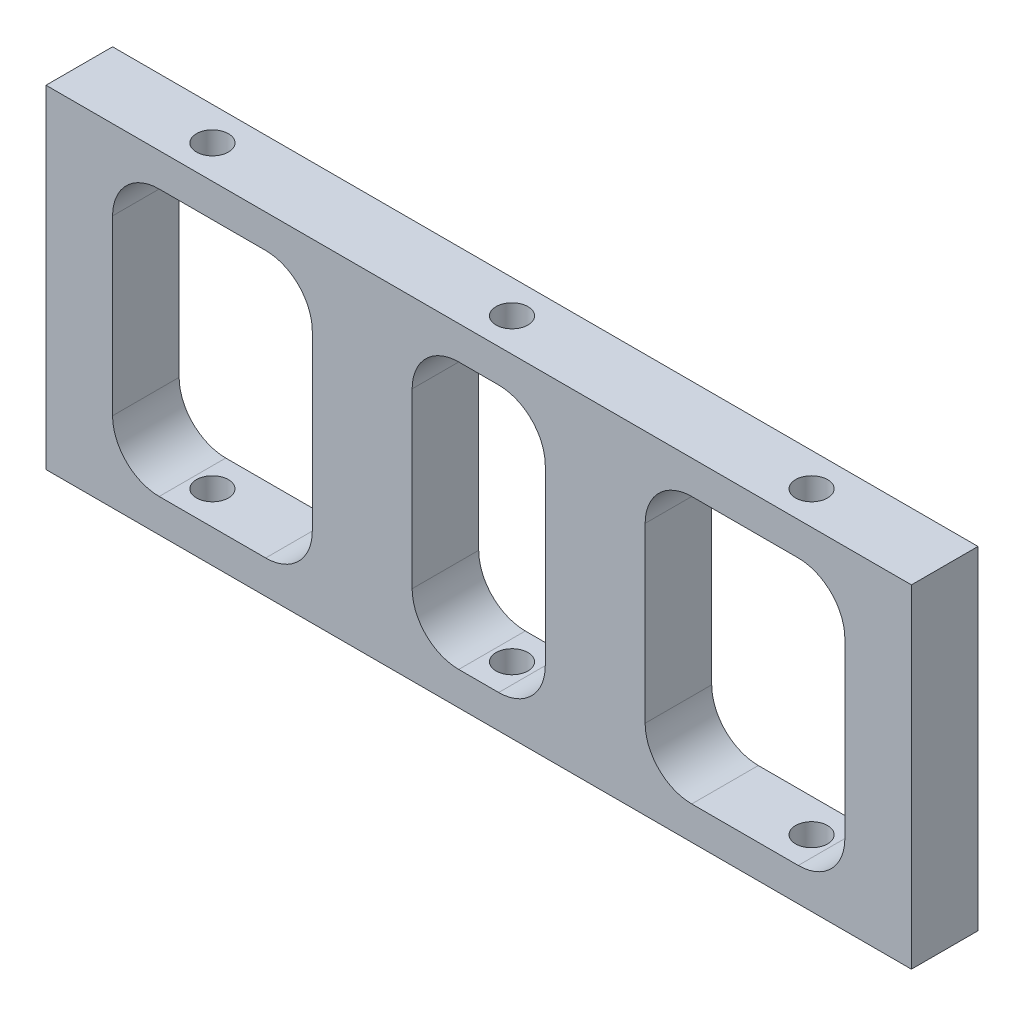
ISO-10303-21;
HEADER;
FILE_DESCRIPTION(('STEP AP214'),'2;1');
FILE_NAME('part.step','',(''),(''),'','','');
FILE_SCHEMA(('AUTOMOTIVE_DESIGN { 1 0 10303 214 1 1 1 1 }'));
ENDSEC;
DATA;
#1=APPLICATION_CONTEXT('core data for automotive mechanical design processes');
#2=APPLICATION_PROTOCOL_DEFINITION('international standard','automotive_design',2000,#1);
#3=PRODUCT_CONTEXT('',#1,'mechanical');
#4=PRODUCT('Part','Part','',(#3));
#5=PRODUCT_RELATED_PRODUCT_CATEGORY('part','',(#4));
#6=PRODUCT_DEFINITION_FORMATION('','',#4);
#7=PRODUCT_DEFINITION_CONTEXT('part definition',#1,'design');
#8=PRODUCT_DEFINITION('design','',#6,#7);
#9=PRODUCT_DEFINITION_SHAPE('','',#8);
#10=(LENGTH_UNIT() NAMED_UNIT(*) SI_UNIT(.MILLI.,.METRE.));
#11=(NAMED_UNIT(*) PLANE_ANGLE_UNIT() SI_UNIT($,.RADIAN.));
#12=(NAMED_UNIT(*) SI_UNIT($,.STERADIAN.) SOLID_ANGLE_UNIT());
#13=UNCERTAINTY_MEASURE_WITH_UNIT(LENGTH_MEASURE(1.E-05),#10,'distance_accuracy_value','');
#14=(GEOMETRIC_REPRESENTATION_CONTEXT(3) GLOBAL_UNCERTAINTY_ASSIGNED_CONTEXT((#13)) GLOBAL_UNIT_ASSIGNED_CONTEXT((#10,
#11,#12)) REPRESENTATION_CONTEXT('',''));
#15=CARTESIAN_POINT('',(0.,0.,0.));
#16=DIRECTION('',(0.,0.,1.));
#17=DIRECTION('',(1.,0.,0.));
#18=AXIS2_PLACEMENT_3D('',#15,#16,#17);
#19=CARTESIAN_POINT('',(0.,50.,10.));
#20=DIRECTION('',(0.,1.,0.));
#21=DIRECTION('',(-1.,0.,0.));
#22=AXIS2_PLACEMENT_3D('',#19,#20,#21);
#23=PLANE('',#22);
#24=CARTESIAN_POINT('',(20.,50.,5.));
#25=DIRECTION('',(0.,1.,0.));
#26=DIRECTION('',(0.,0.,1.));
#27=AXIS2_PLACEMENT_3D('',#24,#25,#26);
#28=CIRCLE('',#27,2.4);
#29=CARTESIAN_POINT('',(20.,50.,7.4));
#30=VERTEX_POINT('',#29);
#31=EDGE_CURVE('E685',#30,#30,#28,.T.);
#32=ORIENTED_EDGE('',*,*,#31,.F.);
#33=EDGE_LOOP('',(#32));
#34=FACE_BOUND('',#33,.T.);
#35=CARTESIAN_POINT('',(65.,50.,5.));
#36=DIRECTION('',(0.,1.,0.));
#37=DIRECTION('',(0.,0.,1.));
#38=AXIS2_PLACEMENT_3D('',#35,#36,#37);
#39=CIRCLE('',#38,2.4);
#40=CARTESIAN_POINT('',(65.,50.,7.4));
#41=VERTEX_POINT('',#40);
#42=EDGE_CURVE('E688',#41,#41,#39,.T.);
#43=ORIENTED_EDGE('',*,*,#42,.F.);
#44=EDGE_LOOP('',(#43));
#45=FACE_BOUND('',#44,.T.);
#46=CARTESIAN_POINT('',(110.,50.,5.));
#47=DIRECTION('',(0.,1.,0.));
#48=DIRECTION('',(0.,0.,1.));
#49=AXIS2_PLACEMENT_3D('',#46,#47,#48);
#50=CIRCLE('',#49,2.4);
#51=CARTESIAN_POINT('',(110.,50.,7.4));
#52=VERTEX_POINT('',#51);
#53=EDGE_CURVE('E701',#52,#52,#50,.T.);
#54=ORIENTED_EDGE('',*,*,#53,.F.);
#55=EDGE_LOOP('',(#54));
#56=FACE_BOUND('',#55,.T.);
#57=DIRECTION('',(1.,0.,0.));
#58=VECTOR('',#57,1.);
#59=CARTESIAN_POINT('',(0.,50.,0.));
#60=LINE('',#59,#58);
#61=CARTESIAN_POINT('',(0.,50.,0.));
#62=VERTEX_POINT('',#61);
#63=CARTESIAN_POINT('',(130.,50.0000000000001,0.));
#64=VERTEX_POINT('',#63);
#65=EDGE_CURVE('E236',#62,#64,#60,.T.);
#66=ORIENTED_EDGE('',*,*,#65,.F.);
#67=DIRECTION('',(0.,0.,-1.));
#68=VECTOR('',#67,1.);
#69=CARTESIAN_POINT('',(0.,50.,10.));
#70=LINE('',#69,#68);
#71=CARTESIAN_POINT('',(0.,50.,10.));
#72=VERTEX_POINT('',#71);
#73=EDGE_CURVE('E232',#72,#62,#70,.T.);
#74=ORIENTED_EDGE('',*,*,#73,.F.);
#75=DIRECTION('',(1.,0.,0.));
#76=VECTOR('',#75,1.);
#77=CARTESIAN_POINT('',(0.,50.,10.));
#78=LINE('',#77,#76);
#79=CARTESIAN_POINT('',(130.,50.0000000000001,10.));
#80=VERTEX_POINT('',#79);
#81=EDGE_CURVE('E234',#72,#80,#78,.T.);
#82=ORIENTED_EDGE('',*,*,#81,.T.);
#83=DIRECTION('',(0.,0.,-1.));
#84=VECTOR('',#83,1.);
#85=CARTESIAN_POINT('',(130.,50.0000000000001,10.));
#86=LINE('',#85,#84);
#87=EDGE_CURVE('E266',#80,#64,#86,.T.);
#88=ORIENTED_EDGE('',*,*,#87,.T.);
#89=EDGE_LOOP('',(#66,#74,#82,#88));
#90=FACE_BOUND('',#89,.T.);
#91=ADVANCED_FACE('F45',(#34,#45,#56,#90),#23,.T.);
#92=CARTESIAN_POINT('',(0.,0.,10.));
#93=DIRECTION('',(-1.,0.,0.));
#94=DIRECTION('',(0.,-1.,0.));
#95=AXIS2_PLACEMENT_3D('',#92,#93,#94);
#96=PLANE('',#95);
#97=DIRECTION('',(0.,1.,0.));
#98=VECTOR('',#97,1.);
#99=CARTESIAN_POINT('',(0.,0.,0.));
#100=LINE('',#99,#98);
#101=CARTESIAN_POINT('',(0.,0.,0.));
#102=VERTEX_POINT('',#101);
#103=EDGE_CURVE('E304',#102,#62,#100,.T.);
#104=ORIENTED_EDGE('',*,*,#103,.F.);
#105=DIRECTION('',(0.,0.,-1.));
#106=VECTOR('',#105,1.);
#107=CARTESIAN_POINT('',(0.,0.,10.));
#108=LINE('',#107,#106);
#109=CARTESIAN_POINT('',(0.,0.,10.));
#110=VERTEX_POINT('',#109);
#111=EDGE_CURVE('E243',#110,#102,#108,.T.);
#112=ORIENTED_EDGE('',*,*,#111,.F.);
#113=DIRECTION('',(0.,1.,0.));
#114=VECTOR('',#113,1.);
#115=CARTESIAN_POINT('',(0.,0.,10.));
#116=LINE('',#115,#114);
#117=EDGE_CURVE('E249',#110,#72,#116,.T.);
#118=ORIENTED_EDGE('',*,*,#117,.T.);
#119=ORIENTED_EDGE('',*,*,#73,.T.);
#120=EDGE_LOOP('',(#104,#112,#118,#119));
#121=FACE_BOUND('',#120,.T.);
#122=ADVANCED_FACE('F255',(#121),#96,.T.);
#123=CARTESIAN_POINT('',(0.,0.,10.));
#124=DIRECTION('',(0.,1.,0.));
#125=DIRECTION('',(-1.,0.,0.));
#126=AXIS2_PLACEMENT_3D('',#123,#124,#125);
#127=PLANE('',#126);
#128=CARTESIAN_POINT('',(20.,0.,5.));
#129=DIRECTION('',(0.,1.,0.));
#130=DIRECTION('',(0.,0.,1.));
#131=AXIS2_PLACEMENT_3D('',#128,#129,#130);
#132=CIRCLE('',#131,2.4);
#133=CARTESIAN_POINT('',(20.,0.,7.4));
#134=VERTEX_POINT('',#133);
#135=EDGE_CURVE('E329',#134,#134,#132,.T.);
#136=ORIENTED_EDGE('',*,*,#135,.T.);
#137=EDGE_LOOP('',(#136));
#138=FACE_BOUND('',#137,.T.);
#139=CARTESIAN_POINT('',(65.,0.,5.));
#140=DIRECTION('',(0.,1.,0.));
#141=DIRECTION('',(0.,0.,1.));
#142=AXIS2_PLACEMENT_3D('',#139,#140,#141);
#143=CIRCLE('',#142,2.4);
#144=CARTESIAN_POINT('',(65.,0.,7.4));
#145=VERTEX_POINT('',#144);
#146=EDGE_CURVE('E695',#145,#145,#143,.T.);
#147=ORIENTED_EDGE('',*,*,#146,.T.);
#148=EDGE_LOOP('',(#147));
#149=FACE_BOUND('',#148,.T.);
#150=CARTESIAN_POINT('',(110.,0.,5.));
#151=DIRECTION('',(0.,1.,0.));
#152=DIRECTION('',(0.,0.,1.));
#153=AXIS2_PLACEMENT_3D('',#150,#151,#152);
#154=CIRCLE('',#153,2.4);
#155=CARTESIAN_POINT('',(110.,0.,7.4));
#156=VERTEX_POINT('',#155);
#157=EDGE_CURVE('E705',#156,#156,#154,.T.);
#158=ORIENTED_EDGE('',*,*,#157,.T.);
#159=EDGE_LOOP('',(#158));
#160=FACE_BOUND('',#159,.T.);
#161=DIRECTION('',(1.,0.,0.));
#162=VECTOR('',#161,1.);
#163=CARTESIAN_POINT('',(0.,0.,0.));
#164=LINE('',#163,#162);
#165=CARTESIAN_POINT('',(130.,0.,0.));
#166=VERTEX_POINT('',#165);
#167=EDGE_CURVE('E307',#102,#166,#164,.T.);
#168=ORIENTED_EDGE('',*,*,#167,.T.);
#169=DIRECTION('',(0.,0.,-1.));
#170=VECTOR('',#169,1.);
#171=CARTESIAN_POINT('',(130.,0.,10.));
#172=LINE('',#171,#170);
#173=CARTESIAN_POINT('',(130.,0.,10.));
#174=VERTEX_POINT('',#173);
#175=EDGE_CURVE('E318',#174,#166,#172,.T.);
#176=ORIENTED_EDGE('',*,*,#175,.F.);
#177=DIRECTION('',(1.,0.,0.));
#178=VECTOR('',#177,1.);
#179=CARTESIAN_POINT('',(0.,0.,10.));
#180=LINE('',#179,#178);
#181=EDGE_CURVE('E258',#110,#174,#180,.T.);
#182=ORIENTED_EDGE('',*,*,#181,.F.);
#183=ORIENTED_EDGE('',*,*,#111,.T.);
#184=EDGE_LOOP('',(#168,#176,#182,#183));
#185=FACE_BOUND('',#184,.T.);
#186=ADVANCED_FACE('F624',(#138,#149,#160,#185),#127,.F.);
#187=CARTESIAN_POINT('',(40.,0.,10.));
#188=DIRECTION('',(1.,0.,0.));
#189=DIRECTION('',(0.,1.,0.));
#190=AXIS2_PLACEMENT_3D('',#187,#188,#189);
#191=PLANE('',#190);
#192=DIRECTION('',(0.,-1.,0.));
#193=VECTOR('',#192,1.);
#194=CARTESIAN_POINT('',(40.,0.,10.));
#195=LINE('',#194,#193);
#196=CARTESIAN_POINT('',(40.,38.,10.));
#197=VERTEX_POINT('',#196);
#198=CARTESIAN_POINT('',(40.,12.,10.));
#199=VERTEX_POINT('',#198);
#200=EDGE_CURVE('E527',#197,#199,#195,.T.);
#201=ORIENTED_EDGE('',*,*,#200,.F.);
#202=DIRECTION('',(0.,0.,-1.));
#203=VECTOR('',#202,1.);
#204=CARTESIAN_POINT('',(40.,38.,0.));
#205=LINE('',#204,#203);
#206=CARTESIAN_POINT('',(40.,38.,0.));
#207=VERTEX_POINT('',#206);
#208=EDGE_CURVE('E398',#197,#207,#205,.T.);
#209=ORIENTED_EDGE('',*,*,#208,.T.);
#210=DIRECTION('',(0.,-1.,0.));
#211=VECTOR('',#210,1.);
#212=CARTESIAN_POINT('',(40.,0.,0.));
#213=LINE('',#212,#211);
#214=CARTESIAN_POINT('',(40.,12.,0.));
#215=VERTEX_POINT('',#214);
#216=EDGE_CURVE('E272',#207,#215,#213,.T.);
#217=ORIENTED_EDGE('',*,*,#216,.T.);
#218=DIRECTION('',(0.,0.,-1.));
#219=VECTOR('',#218,1.);
#220=CARTESIAN_POINT('',(40.,12.,10.));
#221=LINE('',#220,#219);
#222=EDGE_CURVE('E395',#215,#199,#221,.F.);
#223=ORIENTED_EDGE('',*,*,#222,.T.);
#224=EDGE_LOOP('',(#201,#209,#217,#223));
#225=FACE_BOUND('',#224,.T.);
#226=ADVANCED_FACE('F639',(#225),#191,.F.);
#227=CARTESIAN_POINT('',(0.,5.,10.));
#228=DIRECTION('',(0.,1.,0.));
#229=DIRECTION('',(-1.,0.,0.));
#230=AXIS2_PLACEMENT_3D('',#227,#228,#229);
#231=PLANE('',#230);
#232=CARTESIAN_POINT('',(20.,5.,5.));
#233=DIRECTION('',(0.,1.,0.));
#234=DIRECTION('',(-1.,0.,0.));
#235=AXIS2_PLACEMENT_3D('',#232,#233,#234);
#236=CIRCLE('',#235,2.4);
#237=CARTESIAN_POINT('',(17.6,5.,5.));
#238=VERTEX_POINT('',#237);
#239=EDGE_CURVE('E328',#238,#238,#236,.T.);
#240=ORIENTED_EDGE('',*,*,#239,.F.);
#241=EDGE_LOOP('',(#240));
#242=FACE_BOUND('',#241,.T.);
#243=DIRECTION('',(1.,0.,0.));
#244=VECTOR('',#243,1.);
#245=CARTESIAN_POINT('',(0.,5.,10.));
#246=LINE('',#245,#244);
#247=CARTESIAN_POINT('',(17.,5.,10.));
#248=VERTEX_POINT('',#247);
#249=CARTESIAN_POINT('',(33.,5.,10.));
#250=VERTEX_POINT('',#249);
#251=EDGE_CURVE('E510',#248,#250,#246,.T.);
#252=ORIENTED_EDGE('',*,*,#251,.T.);
#253=DIRECTION('',(0.,0.,-1.));
#254=VECTOR('',#253,1.);
#255=CARTESIAN_POINT('',(33.,5.,10.));
#256=LINE('',#255,#254);
#257=CARTESIAN_POINT('',(33.,5.,0.));
#258=VERTEX_POINT('',#257);
#259=EDGE_CURVE('E412',#250,#258,#256,.T.);
#260=ORIENTED_EDGE('',*,*,#259,.T.);
#261=DIRECTION('',(1.,0.,0.));
#262=VECTOR('',#261,1.);
#263=CARTESIAN_POINT('',(0.,5.,0.));
#264=LINE('',#263,#262);
#265=CARTESIAN_POINT('',(17.,5.,0.));
#266=VERTEX_POINT('',#265);
#267=EDGE_CURVE('E267',#266,#258,#264,.T.);
#268=ORIENTED_EDGE('',*,*,#267,.F.);
#269=DIRECTION('',(0.,0.,-1.));
#270=VECTOR('',#269,1.);
#271=CARTESIAN_POINT('',(17.,5.,10.));
#272=LINE('',#271,#270);
#273=EDGE_CURVE('E409',#266,#248,#272,.F.);
#274=ORIENTED_EDGE('',*,*,#273,.T.);
#275=EDGE_LOOP('',(#252,#260,#268,#274));
#276=FACE_BOUND('',#275,.T.);
#277=ADVANCED_FACE('F636',(#242,#276),#231,.T.);
#278=CARTESIAN_POINT('',(10.,0.,10.));
#279=DIRECTION('',(-1.,0.,0.));
#280=DIRECTION('',(0.,0.,1.));
#281=AXIS2_PLACEMENT_3D('',#278,#279,#280);
#282=PLANE('',#281);
#283=DIRECTION('',(0.,1.,0.));
#284=VECTOR('',#283,1.);
#285=CARTESIAN_POINT('',(10.,0.,10.));
#286=LINE('',#285,#284);
#287=CARTESIAN_POINT('',(10.,12.,10.));
#288=VERTEX_POINT('',#287);
#289=CARTESIAN_POINT('',(10.,38.,10.));
#290=VERTEX_POINT('',#289);
#291=EDGE_CURVE('E501',#288,#290,#286,.T.);
#292=ORIENTED_EDGE('',*,*,#291,.F.);
#293=DIRECTION('',(0.,0.,-1.));
#294=VECTOR('',#293,1.);
#295=CARTESIAN_POINT('',(10.,12.,10.));
#296=LINE('',#295,#294);
#297=CARTESIAN_POINT('',(10.,12.,0.));
#298=VERTEX_POINT('',#297);
#299=EDGE_CURVE('E418',#288,#298,#296,.T.);
#300=ORIENTED_EDGE('',*,*,#299,.T.);
#301=DIRECTION('',(0.,1.,0.));
#302=VECTOR('',#301,1.);
#303=CARTESIAN_POINT('',(10.,0.,0.));
#304=LINE('',#303,#302);
#305=CARTESIAN_POINT('',(10.,38.,0.));
#306=VERTEX_POINT('',#305);
#307=EDGE_CURVE('E271',#298,#306,#304,.T.);
#308=ORIENTED_EDGE('',*,*,#307,.T.);
#309=DIRECTION('',(0.,0.,-1.));
#310=VECTOR('',#309,1.);
#311=CARTESIAN_POINT('',(10.,38.,10.));
#312=LINE('',#311,#310);
#313=EDGE_CURVE('E61',#306,#290,#312,.F.);
#314=ORIENTED_EDGE('',*,*,#313,.T.);
#315=EDGE_LOOP('',(#292,#300,#308,#314));
#316=FACE_BOUND('',#315,.T.);
#317=ADVANCED_FACE('F495',(#316),#282,.F.);
#318=CARTESIAN_POINT('',(110.,5.00000000000001,5.));
#319=DIRECTION('',(0.,1.,0.));
#320=DIRECTION('',(-1.,0.,0.));
#321=AXIS2_PLACEMENT_3D('',#318,#319,#320);
#322=CIRCLE('',#321,2.4);
#323=CARTESIAN_POINT('',(107.6,5.00000000000001,5.));
#324=VERTEX_POINT('',#323);
#325=EDGE_CURVE('E339',#324,#324,#322,.T.);
#326=ORIENTED_EDGE('',*,*,#325,.F.);
#327=EDGE_LOOP('',(#326));
#328=FACE_BOUND('',#327,.T.);
#329=CARTESIAN_POINT('',(97.0000000000001,5.00000000000001,10.));
#330=VERTEX_POINT('',#329);
#331=CARTESIAN_POINT('',(113.,5.00000000000001,10.));
#332=VERTEX_POINT('',#331);
#333=EDGE_CURVE('E530',#330,#332,#246,.T.);
#334=ORIENTED_EDGE('',*,*,#333,.T.);
#335=DIRECTION('',(0.,0.,-1.));
#336=VECTOR('',#335,1.);
#337=CARTESIAN_POINT('',(113.,5.00000000000001,0.));
#338=LINE('',#337,#336);
#339=CARTESIAN_POINT('',(113.,5.00000000000001,0.));
#340=VERTEX_POINT('',#339);
#341=EDGE_CURVE('E363',#332,#340,#338,.T.);
#342=ORIENTED_EDGE('',*,*,#341,.T.);
#343=CARTESIAN_POINT('',(97.0000000000001,5.00000000000001,0.));
#344=VERTEX_POINT('',#343);
#345=EDGE_CURVE('E274',#344,#340,#264,.T.);
#346=ORIENTED_EDGE('',*,*,#345,.F.);
#347=DIRECTION('',(0.,0.,-1.));
#348=VECTOR('',#347,1.);
#349=CARTESIAN_POINT('',(97.0000000000001,5.00000000000001,10.));
#350=LINE('',#349,#348);
#351=EDGE_CURVE('E360',#344,#330,#350,.F.);
#352=ORIENTED_EDGE('',*,*,#351,.T.);
#353=EDGE_LOOP('',(#334,#342,#346,#352));
#354=FACE_BOUND('',#353,.T.);
#355=ADVANCED_FACE('F581',(#328,#354),#231,.T.);
#356=CARTESIAN_POINT('',(90.0000000000001,0.,10.));
#357=DIRECTION('',(-1.,0.,0.));
#358=DIRECTION('',(0.,-1.,0.));
#359=AXIS2_PLACEMENT_3D('',#356,#357,#358);
#360=PLANE('',#359);
#361=DIRECTION('',(0.,1.,0.));
#362=VECTOR('',#361,1.);
#363=CARTESIAN_POINT('',(90.0000000000001,0.,0.));
#364=LINE('',#363,#362);
#365=CARTESIAN_POINT('',(90.0000000000001,12.,0.));
#366=VERTEX_POINT('',#365);
#367=CARTESIAN_POINT('',(90.,38.,0.));
#368=VERTEX_POINT('',#367);
#369=EDGE_CURVE('E289',#366,#368,#364,.T.);
#370=ORIENTED_EDGE('',*,*,#369,.T.);
#371=DIRECTION('',(0.,0.,-1.));
#372=VECTOR('',#371,1.);
#373=CARTESIAN_POINT('',(90.,38.,10.));
#374=LINE('',#373,#372);
#375=CARTESIAN_POINT('',(90.,38.,10.));
#376=VERTEX_POINT('',#375);
#377=EDGE_CURVE('E357',#368,#376,#374,.F.);
#378=ORIENTED_EDGE('',*,*,#377,.T.);
#379=DIRECTION('',(0.,1.,0.));
#380=VECTOR('',#379,1.);
#381=CARTESIAN_POINT('',(90.0000000000001,0.,10.));
#382=LINE('',#381,#380);
#383=CARTESIAN_POINT('',(90.0000000000001,12.,10.));
#384=VERTEX_POINT('',#383);
#385=EDGE_CURVE('E520',#384,#376,#382,.T.);
#386=ORIENTED_EDGE('',*,*,#385,.F.);
#387=DIRECTION('',(0.,0.,-1.));
#388=VECTOR('',#387,1.);
#389=CARTESIAN_POINT('',(90.0000000000001,12.,10.));
#390=LINE('',#389,#388);
#391=EDGE_CURVE('E353',#384,#366,#390,.T.);
#392=ORIENTED_EDGE('',*,*,#391,.T.);
#393=EDGE_LOOP('',(#370,#378,#386,#392));
#394=FACE_BOUND('',#393,.T.);
#395=ADVANCED_FACE('F589',(#394),#360,.F.);
#396=CARTESIAN_POINT('',(0.,45.,10.));
#397=DIRECTION('',(0.,1.,0.));
#398=DIRECTION('',(-1.,0.,0.));
#399=AXIS2_PLACEMENT_3D('',#396,#397,#398);
#400=PLANE('',#399);
#401=CARTESIAN_POINT('',(110.,45.,5.));
#402=DIRECTION('',(0.,1.,0.));
#403=DIRECTION('',(-1.,0.,0.));
#404=AXIS2_PLACEMENT_3D('',#401,#402,#403);
#405=CIRCLE('',#404,2.4);
#406=CARTESIAN_POINT('',(107.6,45.,5.));
#407=VERTEX_POINT('',#406);
#408=EDGE_CURVE('E335',#407,#407,#405,.T.);
#409=ORIENTED_EDGE('',*,*,#408,.T.);
#410=EDGE_LOOP('',(#409));
#411=FACE_BOUND('',#410,.T.);
#412=DIRECTION('',(1.,0.,0.));
#413=VECTOR('',#412,1.);
#414=CARTESIAN_POINT('',(0.,45.,0.));
#415=LINE('',#414,#413);
#416=CARTESIAN_POINT('',(97.,45.,0.));
#417=VERTEX_POINT('',#416);
#418=CARTESIAN_POINT('',(113.,45.,0.));
#419=VERTEX_POINT('',#418);
#420=EDGE_CURVE('E284',#417,#419,#415,.T.);
#421=ORIENTED_EDGE('',*,*,#420,.T.);
#422=DIRECTION('',(0.,0.,-1.));
#423=VECTOR('',#422,1.);
#424=CARTESIAN_POINT('',(113.,45.,10.));
#425=LINE('',#424,#423);
#426=CARTESIAN_POINT('',(113.,45.,10.));
#427=VERTEX_POINT('',#426);
#428=EDGE_CURVE('E350',#419,#427,#425,.F.);
#429=ORIENTED_EDGE('',*,*,#428,.T.);
#430=DIRECTION('',(1.,0.,0.));
#431=VECTOR('',#430,1.);
#432=CARTESIAN_POINT('',(0.,45.,10.));
#433=LINE('',#432,#431);
#434=CARTESIAN_POINT('',(97.,45.,10.));
#435=VERTEX_POINT('',#434);
#436=EDGE_CURVE('E508',#435,#427,#433,.T.);
#437=ORIENTED_EDGE('',*,*,#436,.F.);
#438=DIRECTION('',(0.,0.,-1.));
#439=VECTOR('',#438,1.);
#440=CARTESIAN_POINT('',(97.,45.,0.));
#441=LINE('',#440,#439);
#442=EDGE_CURVE('E346',#435,#417,#441,.T.);
#443=ORIENTED_EDGE('',*,*,#442,.T.);
#444=EDGE_LOOP('',(#421,#429,#437,#443));
#445=FACE_BOUND('',#444,.T.);
#446=ADVANCED_FACE('F596',(#411,#445),#400,.F.);
#447=CARTESIAN_POINT('',(65.,5.,5.));
#448=DIRECTION('',(0.,1.,0.));
#449=DIRECTION('',(-1.,0.,0.));
#450=AXIS2_PLACEMENT_3D('',#447,#448,#449);
#451=CIRCLE('',#450,2.4);
#452=CARTESIAN_POINT('',(62.6,5.,5.));
#453=VERTEX_POINT('',#452);
#454=EDGE_CURVE('E334',#453,#453,#451,.T.);
#455=ORIENTED_EDGE('',*,*,#454,.F.);
#456=EDGE_LOOP('',(#455));
#457=FACE_BOUND('',#456,.T.);
#458=CARTESIAN_POINT('',(62.,5.,10.));
#459=VERTEX_POINT('',#458);
#460=CARTESIAN_POINT('',(68.,5.,10.));
#461=VERTEX_POINT('',#460);
#462=EDGE_CURVE('E315',#459,#461,#246,.T.);
#463=ORIENTED_EDGE('',*,*,#462,.T.);
#464=DIRECTION('',(0.,0.,-1.));
#465=VECTOR('',#464,1.);
#466=CARTESIAN_POINT('',(68.,5.,0.));
#467=LINE('',#466,#465);
#468=CARTESIAN_POINT('',(68.,5.,0.));
#469=VERTEX_POINT('',#468);
#470=EDGE_CURVE('E370',#461,#469,#467,.T.);
#471=ORIENTED_EDGE('',*,*,#470,.T.);
#472=CARTESIAN_POINT('',(62.,5.,0.));
#473=VERTEX_POINT('',#472);
#474=EDGE_CURVE('E273',#473,#469,#264,.T.);
#475=ORIENTED_EDGE('',*,*,#474,.F.);
#476=DIRECTION('',(0.,0.,-1.));
#477=VECTOR('',#476,1.);
#478=CARTESIAN_POINT('',(62.,5.,10.));
#479=LINE('',#478,#477);
#480=EDGE_CURVE('E367',#473,#459,#479,.F.);
#481=ORIENTED_EDGE('',*,*,#480,.T.);
#482=EDGE_LOOP('',(#463,#471,#475,#481));
#483=FACE_BOUND('',#482,.T.);
#484=ADVANCED_FACE('F570',(#457,#483),#231,.T.);
#485=CARTESIAN_POINT('',(55.,0.,10.));
#486=DIRECTION('',(1.,0.,0.));
#487=DIRECTION('',(0.,1.,0.));
#488=AXIS2_PLACEMENT_3D('',#485,#486,#487);
#489=PLANE('',#488);
#490=DIRECTION('',(0.,-1.,0.));
#491=VECTOR('',#490,1.);
#492=CARTESIAN_POINT('',(55.,0.,0.));
#493=LINE('',#492,#491);
#494=CARTESIAN_POINT('',(55.,38.,0.));
#495=VERTEX_POINT('',#494);
#496=CARTESIAN_POINT('',(55.,12.,0.));
#497=VERTEX_POINT('',#496);
#498=EDGE_CURVE('E275',#495,#497,#493,.T.);
#499=ORIENTED_EDGE('',*,*,#498,.F.);
#500=DIRECTION('',(0.,0.,-1.));
#501=VECTOR('',#500,1.);
#502=CARTESIAN_POINT('',(55.,38.,10.));
#503=LINE('',#502,#501);
#504=CARTESIAN_POINT('',(55.,38.,10.));
#505=VERTEX_POINT('',#504);
#506=EDGE_CURVE('E392',#495,#505,#503,.F.);
#507=ORIENTED_EDGE('',*,*,#506,.T.);
#508=DIRECTION('',(0.,-1.,0.));
#509=VECTOR('',#508,1.);
#510=CARTESIAN_POINT('',(55.,0.,10.));
#511=LINE('',#510,#509);
#512=CARTESIAN_POINT('',(55.,12.,10.));
#513=VERTEX_POINT('',#512);
#514=EDGE_CURVE('E516',#505,#513,#511,.T.);
#515=ORIENTED_EDGE('',*,*,#514,.T.);
#516=DIRECTION('',(0.,0.,-1.));
#517=VECTOR('',#516,1.);
#518=CARTESIAN_POINT('',(55.,12.,0.));
#519=LINE('',#518,#517);
#520=EDGE_CURVE('E388',#513,#497,#519,.T.);
#521=ORIENTED_EDGE('',*,*,#520,.T.);
#522=EDGE_LOOP('',(#499,#507,#515,#521));
#523=FACE_BOUND('',#522,.T.);
#524=ADVANCED_FACE('F558',(#523),#489,.T.);
#525=CARTESIAN_POINT('',(65.,45.,5.));
#526=DIRECTION('',(0.,1.,0.));
#527=DIRECTION('',(-1.,0.,0.));
#528=AXIS2_PLACEMENT_3D('',#525,#526,#527);
#529=CIRCLE('',#528,2.4);
#530=CARTESIAN_POINT('',(62.6,45.,5.));
#531=VERTEX_POINT('',#530);
#532=EDGE_CURVE('E330',#531,#531,#529,.T.);
#533=ORIENTED_EDGE('',*,*,#532,.T.);
#534=EDGE_LOOP('',(#533));
#535=FACE_BOUND('',#534,.T.);
#536=CARTESIAN_POINT('',(62.,45.,0.));
#537=VERTEX_POINT('',#536);
#538=CARTESIAN_POINT('',(68.,45.,0.));
#539=VERTEX_POINT('',#538);
#540=EDGE_CURVE('E279',#537,#539,#415,.T.);
#541=ORIENTED_EDGE('',*,*,#540,.T.);
#542=DIRECTION('',(0.,0.,-1.));
#543=VECTOR('',#542,1.);
#544=CARTESIAN_POINT('',(68.,45.,10.));
#545=LINE('',#544,#543);
#546=CARTESIAN_POINT('',(68.,45.,10.));
#547=VERTEX_POINT('',#546);
#548=EDGE_CURVE('E385',#539,#547,#545,.F.);
#549=ORIENTED_EDGE('',*,*,#548,.T.);
#550=CARTESIAN_POINT('',(62.,45.,10.));
#551=VERTEX_POINT('',#550);
#552=EDGE_CURVE('E507',#551,#547,#433,.T.);
#553=ORIENTED_EDGE('',*,*,#552,.F.);
#554=DIRECTION('',(0.,0.,-1.));
#555=VECTOR('',#554,1.);
#556=CARTESIAN_POINT('',(62.,45.,10.));
#557=LINE('',#556,#555);
#558=EDGE_CURVE('E381',#551,#537,#557,.T.);
#559=ORIENTED_EDGE('',*,*,#558,.T.);
#560=EDGE_LOOP('',(#541,#549,#553,#559));
#561=FACE_BOUND('',#560,.T.);
#562=ADVANCED_FACE('F632',(#535,#561),#400,.F.);
#563=CARTESIAN_POINT('',(20.,45.,5.));
#564=DIRECTION('',(0.,1.,0.));
#565=DIRECTION('',(-1.,0.,0.));
#566=AXIS2_PLACEMENT_3D('',#563,#564,#565);
#567=CIRCLE('',#566,2.4);
#568=CARTESIAN_POINT('',(17.6,45.,5.));
#569=VERTEX_POINT('',#568);
#570=EDGE_CURVE('E324',#569,#569,#567,.T.);
#571=ORIENTED_EDGE('',*,*,#570,.T.);
#572=EDGE_LOOP('',(#571));
#573=FACE_BOUND('',#572,.T.);
#574=CARTESIAN_POINT('',(17.,45.,0.));
#575=VERTEX_POINT('',#574);
#576=CARTESIAN_POINT('',(33.,45.,0.));
#577=VERTEX_POINT('',#576);
#578=EDGE_CURVE('E280',#575,#577,#415,.T.);
#579=ORIENTED_EDGE('',*,*,#578,.T.);
#580=DIRECTION('',(0.,0.,-1.));
#581=VECTOR('',#580,1.);
#582=CARTESIAN_POINT('',(33.,45.,10.));
#583=LINE('',#582,#581);
#584=CARTESIAN_POINT('',(33.,45.,10.));
#585=VERTEX_POINT('',#584);
#586=EDGE_CURVE('E406',#577,#585,#583,.F.);
#587=ORIENTED_EDGE('',*,*,#586,.T.);
#588=CARTESIAN_POINT('',(17.,45.,10.));
#589=VERTEX_POINT('',#588);
#590=EDGE_CURVE('E253',#589,#585,#433,.T.);
#591=ORIENTED_EDGE('',*,*,#590,.F.);
#592=DIRECTION('',(0.,0.,-1.));
#593=VECTOR('',#592,1.);
#594=CARTESIAN_POINT('',(17.,45.,0.));
#595=LINE('',#594,#593);
#596=EDGE_CURVE('E402',#589,#575,#595,.T.);
#597=ORIENTED_EDGE('',*,*,#596,.T.);
#598=EDGE_LOOP('',(#579,#587,#591,#597));
#599=FACE_BOUND('',#598,.T.);
#600=ADVANCED_FACE('F503',(#573,#599),#400,.F.);
#601=CARTESIAN_POINT('',(120.,0.,10.));
#602=DIRECTION('',(-1.,0.,0.));
#603=DIRECTION('',(0.,0.,1.));
#604=AXIS2_PLACEMENT_3D('',#601,#602,#603);
#605=PLANE('',#604);
#606=DIRECTION('',(0.,1.,0.));
#607=VECTOR('',#606,1.);
#608=CARTESIAN_POINT('',(120.,0.,10.));
#609=LINE('',#608,#607);
#610=CARTESIAN_POINT('',(120.,12.,10.));
#611=VERTEX_POINT('',#610);
#612=CARTESIAN_POINT('',(120.,38.,10.));
#613=VERTEX_POINT('',#612);
#614=EDGE_CURVE('E519',#611,#613,#609,.T.);
#615=ORIENTED_EDGE('',*,*,#614,.T.);
#616=DIRECTION('',(0.,0.,-1.));
#617=VECTOR('',#616,1.);
#618=CARTESIAN_POINT('',(120.,38.,10.));
#619=LINE('',#618,#617);
#620=CARTESIAN_POINT('',(120.,38.,0.));
#621=VERTEX_POINT('',#620);
#622=EDGE_CURVE('E342',#613,#621,#619,.T.);
#623=ORIENTED_EDGE('',*,*,#622,.T.);
#624=DIRECTION('',(0.,1.,0.));
#625=VECTOR('',#624,1.);
#626=CARTESIAN_POINT('',(120.,0.,0.));
#627=LINE('',#626,#625);
#628=CARTESIAN_POINT('',(120.,12.,0.));
#629=VERTEX_POINT('',#628);
#630=EDGE_CURVE('E293',#629,#621,#627,.T.);
#631=ORIENTED_EDGE('',*,*,#630,.F.);
#632=DIRECTION('',(0.,0.,-1.));
#633=VECTOR('',#632,1.);
#634=CARTESIAN_POINT('',(120.,12.,10.));
#635=LINE('',#634,#633);
#636=EDGE_CURVE('E242',#629,#611,#635,.F.);
#637=ORIENTED_EDGE('',*,*,#636,.T.);
#638=EDGE_LOOP('',(#615,#623,#631,#637));
#639=FACE_BOUND('',#638,.T.);
#640=ADVANCED_FACE('F605',(#639),#605,.T.);
#641=CARTESIAN_POINT('',(75.,0.,10.));
#642=DIRECTION('',(-1.,0.,0.));
#643=DIRECTION('',(0.,-1.,0.));
#644=AXIS2_PLACEMENT_3D('',#641,#642,#643);
#645=PLANE('',#644);
#646=DIRECTION('',(0.,1.,0.));
#647=VECTOR('',#646,1.);
#648=CARTESIAN_POINT('',(75.,0.,0.));
#649=LINE('',#648,#647);
#650=CARTESIAN_POINT('',(75.,12.,0.));
#651=VERTEX_POINT('',#650);
#652=CARTESIAN_POINT('',(75.,38.,0.));
#653=VERTEX_POINT('',#652);
#654=EDGE_CURVE('E285',#651,#653,#649,.T.);
#655=ORIENTED_EDGE('',*,*,#654,.F.);
#656=DIRECTION('',(0.,0.,-1.));
#657=VECTOR('',#656,1.);
#658=CARTESIAN_POINT('',(75.,12.,10.));
#659=LINE('',#658,#657);
#660=CARTESIAN_POINT('',(75.,12.,10.));
#661=VERTEX_POINT('',#660);
#662=EDGE_CURVE('E378',#651,#661,#659,.F.);
#663=ORIENTED_EDGE('',*,*,#662,.T.);
#664=DIRECTION('',(0.,1.,0.));
#665=VECTOR('',#664,1.);
#666=CARTESIAN_POINT('',(75.,0.,10.));
#667=LINE('',#666,#665);
#668=CARTESIAN_POINT('',(75.,38.,10.));
#669=VERTEX_POINT('',#668);
#670=EDGE_CURVE('E515',#661,#669,#667,.T.);
#671=ORIENTED_EDGE('',*,*,#670,.T.);
#672=DIRECTION('',(0.,0.,-1.));
#673=VECTOR('',#672,1.);
#674=CARTESIAN_POINT('',(75.,38.,10.));
#675=LINE('',#674,#673);
#676=EDGE_CURVE('E374',#669,#653,#675,.T.);
#677=ORIENTED_EDGE('',*,*,#676,.T.);
#678=EDGE_LOOP('',(#655,#663,#671,#677));
#679=FACE_BOUND('',#678,.T.);
#680=ADVANCED_FACE('F646',(#679),#645,.T.);
#681=CARTESIAN_POINT('',(130.,1.4432899320127E-13,10.));
#682=DIRECTION('',(-1.,0.,0.));
#683=DIRECTION('',(0.,-1.,0.));
#684=AXIS2_PLACEMENT_3D('',#681,#682,#683);
#685=PLANE('',#684);
#686=DIRECTION('',(0.,1.,0.));
#687=VECTOR('',#686,1.);
#688=CARTESIAN_POINT('',(130.,1.4432899320127E-13,0.));
#689=LINE('',#688,#687);
#690=EDGE_CURVE('E311',#166,#64,#689,.T.);
#691=ORIENTED_EDGE('',*,*,#690,.T.);
#692=ORIENTED_EDGE('',*,*,#87,.F.);
#693=DIRECTION('',(0.,1.,0.));
#694=VECTOR('',#693,1.);
#695=CARTESIAN_POINT('',(130.,1.4432899320127E-13,10.));
#696=LINE('',#695,#694);
#697=EDGE_CURVE('E250',#174,#80,#696,.T.);
#698=ORIENTED_EDGE('',*,*,#697,.F.);
#699=ORIENTED_EDGE('',*,*,#175,.T.);
#700=EDGE_LOOP('',(#691,#692,#698,#699));
#701=FACE_BOUND('',#700,.T.);
#702=ADVANCED_FACE('F651',(#701),#685,.F.);
#703=CARTESIAN_POINT('',(0.,0.,10.));
#704=DIRECTION('',(0.,0.,1.));
#705=DIRECTION('',(1.,0.,0.));
#706=AXIS2_PLACEMENT_3D('',#703,#704,#705);
#707=PLANE('',#706);
#708=ORIENTED_EDGE('',*,*,#462,.F.);
#709=CARTESIAN_POINT('',(62.,12.,10.));
#710=DIRECTION('',(0.,0.,1.));
#711=DIRECTION('',(1.,0.,0.));
#712=AXIS2_PLACEMENT_3D('',#709,#710,#711);
#713=CIRCLE('',#712,7.);
#714=EDGE_CURVE('E467',#459,#513,#713,.F.);
#715=ORIENTED_EDGE('',*,*,#714,.T.);
#716=ORIENTED_EDGE('',*,*,#514,.F.);
#717=CARTESIAN_POINT('',(62.,38.,10.));
#718=DIRECTION('',(0.,0.,1.));
#719=DIRECTION('',(1.,0.,0.));
#720=AXIS2_PLACEMENT_3D('',#717,#718,#719);
#721=CIRCLE('',#720,7.);
#722=EDGE_CURVE('E461',#505,#551,#721,.F.);
#723=ORIENTED_EDGE('',*,*,#722,.T.);
#724=ORIENTED_EDGE('',*,*,#552,.T.);
#725=CARTESIAN_POINT('',(68.,38.,10.));
#726=DIRECTION('',(0.,0.,1.));
#727=DIRECTION('',(1.,0.,0.));
#728=AXIS2_PLACEMENT_3D('',#725,#726,#727);
#729=CIRCLE('',#728,7.);
#730=EDGE_CURVE('E455',#547,#669,#729,.F.);
#731=ORIENTED_EDGE('',*,*,#730,.T.);
#732=ORIENTED_EDGE('',*,*,#670,.F.);
#733=CARTESIAN_POINT('',(68.,12.,10.));
#734=DIRECTION('',(0.,0.,1.));
#735=DIRECTION('',(1.,0.,0.));
#736=AXIS2_PLACEMENT_3D('',#733,#734,#735);
#737=CIRCLE('',#736,7.);
#738=EDGE_CURVE('E449',#661,#461,#737,.F.);
#739=ORIENTED_EDGE('',*,*,#738,.T.);
#740=EDGE_LOOP('',(#708,#715,#716,#723,#724,#731,#732,#739));
#741=FACE_BOUND('',#740,.T.);
#742=ORIENTED_EDGE('',*,*,#333,.F.);
#743=CARTESIAN_POINT('',(97.0000000000001,12.,10.));
#744=DIRECTION('',(0.,0.,1.));
#745=DIRECTION('',(1.,0.,0.));
#746=AXIS2_PLACEMENT_3D('',#743,#744,#745);
#747=CIRCLE('',#746,7.);
#748=EDGE_CURVE('E443',#330,#384,#747,.F.);
#749=ORIENTED_EDGE('',*,*,#748,.T.);
#750=ORIENTED_EDGE('',*,*,#385,.T.);
#751=CARTESIAN_POINT('',(97.,38.,10.));
#752=DIRECTION('',(0.,0.,1.));
#753=DIRECTION('',(1.,0.,0.));
#754=AXIS2_PLACEMENT_3D('',#751,#752,#753);
#755=CIRCLE('',#754,7.);
#756=EDGE_CURVE('E431',#376,#435,#755,.F.);
#757=ORIENTED_EDGE('',*,*,#756,.T.);
#758=ORIENTED_EDGE('',*,*,#436,.T.);
#759=CARTESIAN_POINT('',(113.,38.,10.));
#760=DIRECTION('',(0.,0.,1.));
#761=DIRECTION('',(1.,0.,0.));
#762=AXIS2_PLACEMENT_3D('',#759,#760,#761);
#763=CIRCLE('',#762,7.);
#764=EDGE_CURVE('E425',#427,#613,#763,.F.);
#765=ORIENTED_EDGE('',*,*,#764,.T.);
#766=ORIENTED_EDGE('',*,*,#614,.F.);
#767=CARTESIAN_POINT('',(113.,12.,10.));
#768=DIRECTION('',(0.,0.,1.));
#769=DIRECTION('',(1.,0.,0.));
#770=AXIS2_PLACEMENT_3D('',#767,#768,#769);
#771=CIRCLE('',#770,7.);
#772=EDGE_CURVE('E437',#611,#332,#771,.F.);
#773=ORIENTED_EDGE('',*,*,#772,.T.);
#774=EDGE_LOOP('',(#742,#749,#750,#757,#758,#765,#766,#773));
#775=FACE_BOUND('',#774,.T.);
#776=ORIENTED_EDGE('',*,*,#590,.T.);
#777=CARTESIAN_POINT('',(33.,38.,10.));
#778=DIRECTION('',(0.,0.,1.));
#779=DIRECTION('',(1.,0.,0.));
#780=AXIS2_PLACEMENT_3D('',#777,#778,#779);
#781=CIRCLE('',#780,7.);
#782=EDGE_CURVE('E473',#585,#197,#781,.F.);
#783=ORIENTED_EDGE('',*,*,#782,.T.);
#784=ORIENTED_EDGE('',*,*,#200,.T.);
#785=CARTESIAN_POINT('',(33.,12.,10.));
#786=DIRECTION('',(0.,0.,1.));
#787=DIRECTION('',(1.,0.,0.));
#788=AXIS2_PLACEMENT_3D('',#785,#786,#787);
#789=CIRCLE('',#788,7.);
#790=EDGE_CURVE('E479',#199,#250,#789,.F.);
#791=ORIENTED_EDGE('',*,*,#790,.T.);
#792=ORIENTED_EDGE('',*,*,#251,.F.);
#793=CARTESIAN_POINT('',(17.,12.,10.));
#794=DIRECTION('',(0.,0.,1.));
#795=DIRECTION('',(1.,0.,0.));
#796=AXIS2_PLACEMENT_3D('',#793,#794,#795);
#797=CIRCLE('',#796,7.);
#798=EDGE_CURVE('E68',#248,#288,#797,.F.);
#799=ORIENTED_EDGE('',*,*,#798,.T.);
#800=ORIENTED_EDGE('',*,*,#291,.T.);
#801=CARTESIAN_POINT('',(17.,38.,10.));
#802=DIRECTION('',(0.,0.,1.));
#803=DIRECTION('',(1.,0.,0.));
#804=AXIS2_PLACEMENT_3D('',#801,#802,#803);
#805=CIRCLE('',#804,7.);
#806=EDGE_CURVE('E11',#290,#589,#805,.F.);
#807=ORIENTED_EDGE('',*,*,#806,.T.);
#808=EDGE_LOOP('',(#776,#783,#784,#791,#792,#799,#800,#807));
#809=FACE_BOUND('',#808,.T.);
#810=ORIENTED_EDGE('',*,*,#81,.F.);
#811=ORIENTED_EDGE('',*,*,#117,.F.);
#812=ORIENTED_EDGE('',*,*,#181,.T.);
#813=ORIENTED_EDGE('',*,*,#697,.T.);
#814=EDGE_LOOP('',(#810,#811,#812,#813));
#815=FACE_BOUND('',#814,.T.);
#816=ADVANCED_FACE('F247',(#741,#775,#809,#815),#707,.T.);
#817=CARTESIAN_POINT('',(0.,0.,0.));
#818=DIRECTION('',(0.,0.,1.));
#819=DIRECTION('',(1.,0.,0.));
#820=AXIS2_PLACEMENT_3D('',#817,#818,#819);
#821=PLANE('',#820);
#822=ORIENTED_EDGE('',*,*,#498,.T.);
#823=CARTESIAN_POINT('',(62.,12.,0.));
#824=DIRECTION('',(0.,0.,1.));
#825=DIRECTION('',(1.,0.,0.));
#826=AXIS2_PLACEMENT_3D('',#823,#824,#825);
#827=CIRCLE('',#826,7.);
#828=EDGE_CURVE('E464',#497,#473,#827,.T.);
#829=ORIENTED_EDGE('',*,*,#828,.T.);
#830=ORIENTED_EDGE('',*,*,#474,.T.);
#831=CARTESIAN_POINT('',(68.,12.,0.));
#832=DIRECTION('',(0.,0.,1.));
#833=DIRECTION('',(1.,0.,0.));
#834=AXIS2_PLACEMENT_3D('',#831,#832,#833);
#835=CIRCLE('',#834,7.);
#836=EDGE_CURVE('E446',#469,#651,#835,.T.);
#837=ORIENTED_EDGE('',*,*,#836,.T.);
#838=ORIENTED_EDGE('',*,*,#654,.T.);
#839=CARTESIAN_POINT('',(68.,38.,0.));
#840=DIRECTION('',(0.,0.,1.));
#841=DIRECTION('',(1.,0.,0.));
#842=AXIS2_PLACEMENT_3D('',#839,#840,#841);
#843=CIRCLE('',#842,7.);
#844=EDGE_CURVE('E452',#653,#539,#843,.T.);
#845=ORIENTED_EDGE('',*,*,#844,.T.);
#846=ORIENTED_EDGE('',*,*,#540,.F.);
#847=CARTESIAN_POINT('',(62.,38.,0.));
#848=DIRECTION('',(0.,0.,1.));
#849=DIRECTION('',(1.,0.,0.));
#850=AXIS2_PLACEMENT_3D('',#847,#848,#849);
#851=CIRCLE('',#850,7.);
#852=EDGE_CURVE('E458',#537,#495,#851,.T.);
#853=ORIENTED_EDGE('',*,*,#852,.T.);
#854=EDGE_LOOP('',(#822,#829,#830,#837,#838,#845,#846,#853));
#855=FACE_BOUND('',#854,.T.);
#856=ORIENTED_EDGE('',*,*,#369,.F.);
#857=CARTESIAN_POINT('',(97.0000000000001,12.,0.));
#858=DIRECTION('',(0.,0.,1.));
#859=DIRECTION('',(1.,0.,0.));
#860=AXIS2_PLACEMENT_3D('',#857,#858,#859);
#861=CIRCLE('',#860,7.);
#862=EDGE_CURVE('E440',#366,#344,#861,.T.);
#863=ORIENTED_EDGE('',*,*,#862,.T.);
#864=ORIENTED_EDGE('',*,*,#345,.T.);
#865=CARTESIAN_POINT('',(113.,12.,0.));
#866=DIRECTION('',(0.,0.,1.));
#867=DIRECTION('',(1.,0.,0.));
#868=AXIS2_PLACEMENT_3D('',#865,#866,#867);
#869=CIRCLE('',#868,7.);
#870=EDGE_CURVE('E434',#340,#629,#869,.T.);
#871=ORIENTED_EDGE('',*,*,#870,.T.);
#872=ORIENTED_EDGE('',*,*,#630,.T.);
#873=CARTESIAN_POINT('',(113.,38.,0.));
#874=DIRECTION('',(0.,0.,1.));
#875=DIRECTION('',(1.,0.,0.));
#876=AXIS2_PLACEMENT_3D('',#873,#874,#875);
#877=CIRCLE('',#876,7.);
#878=EDGE_CURVE('E422',#621,#419,#877,.T.);
#879=ORIENTED_EDGE('',*,*,#878,.T.);
#880=ORIENTED_EDGE('',*,*,#420,.F.);
#881=CARTESIAN_POINT('',(97.,38.,0.));
#882=DIRECTION('',(0.,0.,1.));
#883=DIRECTION('',(1.,0.,0.));
#884=AXIS2_PLACEMENT_3D('',#881,#882,#883);
#885=CIRCLE('',#884,7.);
#886=EDGE_CURVE('E428',#417,#368,#885,.T.);
#887=ORIENTED_EDGE('',*,*,#886,.T.);
#888=EDGE_LOOP('',(#856,#863,#864,#871,#872,#879,#880,#887));
#889=FACE_BOUND('',#888,.T.);
#890=ORIENTED_EDGE('',*,*,#216,.F.);
#891=CARTESIAN_POINT('',(33.,38.,0.));
#892=DIRECTION('',(0.,0.,1.));
#893=DIRECTION('',(1.,0.,0.));
#894=AXIS2_PLACEMENT_3D('',#891,#892,#893);
#895=CIRCLE('',#894,7.);
#896=EDGE_CURVE('E470',#207,#577,#895,.T.);
#897=ORIENTED_EDGE('',*,*,#896,.T.);
#898=ORIENTED_EDGE('',*,*,#578,.F.);
#899=CARTESIAN_POINT('',(17.,38.,0.));
#900=DIRECTION('',(0.,0.,1.));
#901=DIRECTION('',(1.,0.,0.));
#902=AXIS2_PLACEMENT_3D('',#899,#900,#901);
#903=CIRCLE('',#902,7.);
#904=EDGE_CURVE('E54',#575,#306,#903,.T.);
#905=ORIENTED_EDGE('',*,*,#904,.T.);
#906=ORIENTED_EDGE('',*,*,#307,.F.);
#907=CARTESIAN_POINT('',(17.,12.,0.));
#908=DIRECTION('',(0.,0.,1.));
#909=DIRECTION('',(1.,0.,0.));
#910=AXIS2_PLACEMENT_3D('',#907,#908,#909);
#911=CIRCLE('',#910,7.);
#912=EDGE_CURVE('E482',#298,#266,#911,.T.);
#913=ORIENTED_EDGE('',*,*,#912,.T.);
#914=ORIENTED_EDGE('',*,*,#267,.T.);
#915=CARTESIAN_POINT('',(33.,12.,0.));
#916=DIRECTION('',(0.,0.,1.));
#917=DIRECTION('',(1.,0.,0.));
#918=AXIS2_PLACEMENT_3D('',#915,#916,#917);
#919=CIRCLE('',#918,7.);
#920=EDGE_CURVE('E476',#258,#215,#919,.T.);
#921=ORIENTED_EDGE('',*,*,#920,.T.);
#922=EDGE_LOOP('',(#890,#897,#898,#905,#906,#913,#914,#921));
#923=FACE_BOUND('',#922,.T.);
#924=ORIENTED_EDGE('',*,*,#65,.T.);
#925=ORIENTED_EDGE('',*,*,#690,.F.);
#926=ORIENTED_EDGE('',*,*,#167,.F.);
#927=ORIENTED_EDGE('',*,*,#103,.T.);
#928=EDGE_LOOP('',(#924,#925,#926,#927));
#929=FACE_BOUND('',#928,.T.);
#930=ADVANCED_FACE('F491',(#855,#889,#923,#929),#821,.F.);
#931=CARTESIAN_POINT('',(20.,0.,5.));
#932=DIRECTION('',(0.,1.,0.));
#933=DIRECTION('',(0.,0.,1.));
#934=AXIS2_PLACEMENT_3D('',#931,#932,#933);
#935=CYLINDRICAL_SURFACE('',#934,2.4);
#936=ORIENTED_EDGE('',*,*,#31,.T.);
#937=EDGE_LOOP('',(#936));
#938=FACE_BOUND('',#937,.T.);
#939=ORIENTED_EDGE('',*,*,#570,.F.);
#940=EDGE_LOOP('',(#939));
#941=FACE_BOUND('',#940,.T.);
#942=ADVANCED_FACE('F663',(#938,#941),#935,.F.);
#943=CARTESIAN_POINT('',(65.,0.,5.));
#944=DIRECTION('',(0.,1.,0.));
#945=DIRECTION('',(0.,0.,1.));
#946=AXIS2_PLACEMENT_3D('',#943,#944,#945);
#947=CYLINDRICAL_SURFACE('',#946,2.4);
#948=ORIENTED_EDGE('',*,*,#42,.T.);
#949=EDGE_LOOP('',(#948));
#950=FACE_BOUND('',#949,.T.);
#951=ORIENTED_EDGE('',*,*,#532,.F.);
#952=EDGE_LOOP('',(#951));
#953=FACE_BOUND('',#952,.T.);
#954=ADVANCED_FACE('F674',(#950,#953),#947,.F.);
#955=ORIENTED_EDGE('',*,*,#454,.T.);
#956=EDGE_LOOP('',(#955));
#957=FACE_BOUND('',#956,.T.);
#958=ORIENTED_EDGE('',*,*,#146,.F.);
#959=EDGE_LOOP('',(#958));
#960=FACE_BOUND('',#959,.T.);
#961=ADVANCED_FACE('F680',(#957,#960),#947,.F.);
#962=CARTESIAN_POINT('',(110.,0.,5.));
#963=DIRECTION('',(0.,1.,0.));
#964=DIRECTION('',(0.,0.,1.));
#965=AXIS2_PLACEMENT_3D('',#962,#963,#964);
#966=CYLINDRICAL_SURFACE('',#965,2.4);
#967=ORIENTED_EDGE('',*,*,#53,.T.);
#968=EDGE_LOOP('',(#967));
#969=FACE_BOUND('',#968,.T.);
#970=ORIENTED_EDGE('',*,*,#408,.F.);
#971=EDGE_LOOP('',(#970));
#972=FACE_BOUND('',#971,.T.);
#973=ADVANCED_FACE('F667',(#969,#972),#966,.F.);
#974=ORIENTED_EDGE('',*,*,#325,.T.);
#975=EDGE_LOOP('',(#974));
#976=FACE_BOUND('',#975,.T.);
#977=ORIENTED_EDGE('',*,*,#157,.F.);
#978=EDGE_LOOP('',(#977));
#979=FACE_BOUND('',#978,.T.);
#980=ADVANCED_FACE('F660',(#976,#979),#966,.F.);
#981=ORIENTED_EDGE('',*,*,#239,.T.);
#982=EDGE_LOOP('',(#981));
#983=FACE_BOUND('',#982,.T.);
#984=ORIENTED_EDGE('',*,*,#135,.F.);
#985=EDGE_LOOP('',(#984));
#986=FACE_BOUND('',#985,.T.);
#987=ADVANCED_FACE('F656',(#983,#986),#935,.F.);
#988=CARTESIAN_POINT('',(113.,38.,10.));
#989=DIRECTION('',(0.,0.,-1.));
#990=DIRECTION('',(-1.,0.,0.));
#991=AXIS2_PLACEMENT_3D('',#988,#989,#990);
#992=CYLINDRICAL_SURFACE('',#991,7.);
#993=ORIENTED_EDGE('',*,*,#764,.F.);
#994=ORIENTED_EDGE('',*,*,#428,.F.);
#995=ORIENTED_EDGE('',*,*,#878,.F.);
#996=ORIENTED_EDGE('',*,*,#622,.F.);
#997=EDGE_LOOP('',(#993,#994,#995,#996));
#998=FACE_BOUND('',#997,.T.);
#999=ADVANCED_FACE('F600',(#998),#992,.F.);
#1000=CARTESIAN_POINT('',(97.,38.,10.));
#1001=DIRECTION('',(0.,0.,1.));
#1002=DIRECTION('',(1.,0.,0.));
#1003=AXIS2_PLACEMENT_3D('',#1000,#1001,#1002);
#1004=CYLINDRICAL_SURFACE('',#1003,7.);
#1005=ORIENTED_EDGE('',*,*,#756,.F.);
#1006=ORIENTED_EDGE('',*,*,#377,.F.);
#1007=ORIENTED_EDGE('',*,*,#886,.F.);
#1008=ORIENTED_EDGE('',*,*,#442,.F.);
#1009=EDGE_LOOP('',(#1005,#1006,#1007,#1008));
#1010=FACE_BOUND('',#1009,.T.);
#1011=ADVANCED_FACE('F592',(#1010),#1004,.F.);
#1012=CARTESIAN_POINT('',(113.,12.,10.));
#1013=DIRECTION('',(0.,0.,1.));
#1014=DIRECTION('',(1.,0.,0.));
#1015=AXIS2_PLACEMENT_3D('',#1012,#1013,#1014);
#1016=CYLINDRICAL_SURFACE('',#1015,7.);
#1017=ORIENTED_EDGE('',*,*,#772,.F.);
#1018=ORIENTED_EDGE('',*,*,#636,.F.);
#1019=ORIENTED_EDGE('',*,*,#870,.F.);
#1020=ORIENTED_EDGE('',*,*,#341,.F.);
#1021=EDGE_LOOP('',(#1017,#1018,#1019,#1020));
#1022=FACE_BOUND('',#1021,.T.);
#1023=ADVANCED_FACE('F608',(#1022),#1016,.F.);
#1024=CARTESIAN_POINT('',(97.0000000000001,12.,10.));
#1025=DIRECTION('',(0.,0.,-1.));
#1026=DIRECTION('',(-1.,0.,0.));
#1027=AXIS2_PLACEMENT_3D('',#1024,#1025,#1026);
#1028=CYLINDRICAL_SURFACE('',#1027,7.);
#1029=ORIENTED_EDGE('',*,*,#748,.F.);
#1030=ORIENTED_EDGE('',*,*,#351,.F.);
#1031=ORIENTED_EDGE('',*,*,#862,.F.);
#1032=ORIENTED_EDGE('',*,*,#391,.F.);
#1033=EDGE_LOOP('',(#1029,#1030,#1031,#1032));
#1034=FACE_BOUND('',#1033,.T.);
#1035=ADVANCED_FACE('F586',(#1034),#1028,.F.);
#1036=CARTESIAN_POINT('',(68.,12.,10.));
#1037=DIRECTION('',(0.,0.,1.));
#1038=DIRECTION('',(1.,0.,0.));
#1039=AXIS2_PLACEMENT_3D('',#1036,#1037,#1038);
#1040=CYLINDRICAL_SURFACE('',#1039,7.);
#1041=ORIENTED_EDGE('',*,*,#738,.F.);
#1042=ORIENTED_EDGE('',*,*,#662,.F.);
#1043=ORIENTED_EDGE('',*,*,#836,.F.);
#1044=ORIENTED_EDGE('',*,*,#470,.F.);
#1045=EDGE_LOOP('',(#1041,#1042,#1043,#1044));
#1046=FACE_BOUND('',#1045,.T.);
#1047=ADVANCED_FACE('F615',(#1046),#1040,.F.);
#1048=CARTESIAN_POINT('',(68.,38.,10.));
#1049=DIRECTION('',(0.,0.,-1.));
#1050=DIRECTION('',(-1.,0.,0.));
#1051=AXIS2_PLACEMENT_3D('',#1048,#1049,#1050);
#1052=CYLINDRICAL_SURFACE('',#1051,7.);
#1053=ORIENTED_EDGE('',*,*,#730,.F.);
#1054=ORIENTED_EDGE('',*,*,#548,.F.);
#1055=ORIENTED_EDGE('',*,*,#844,.F.);
#1056=ORIENTED_EDGE('',*,*,#676,.F.);
#1057=EDGE_LOOP('',(#1053,#1054,#1055,#1056));
#1058=FACE_BOUND('',#1057,.T.);
#1059=ADVANCED_FACE('F902',(#1058),#1052,.F.);
#1060=CARTESIAN_POINT('',(62.,38.,10.));
#1061=DIRECTION('',(0.,0.,-1.));
#1062=DIRECTION('',(-1.,0.,0.));
#1063=AXIS2_PLACEMENT_3D('',#1060,#1061,#1062);
#1064=CYLINDRICAL_SURFACE('',#1063,7.);
#1065=ORIENTED_EDGE('',*,*,#722,.F.);
#1066=ORIENTED_EDGE('',*,*,#506,.F.);
#1067=ORIENTED_EDGE('',*,*,#852,.F.);
#1068=ORIENTED_EDGE('',*,*,#558,.F.);
#1069=EDGE_LOOP('',(#1065,#1066,#1067,#1068));
#1070=FACE_BOUND('',#1069,.T.);
#1071=ADVANCED_FACE('F913',(#1070),#1064,.F.);
#1072=CARTESIAN_POINT('',(62.,12.,10.));
#1073=DIRECTION('',(0.,0.,1.));
#1074=DIRECTION('',(1.,0.,0.));
#1075=AXIS2_PLACEMENT_3D('',#1072,#1073,#1074);
#1076=CYLINDRICAL_SURFACE('',#1075,7.);
#1077=ORIENTED_EDGE('',*,*,#714,.F.);
#1078=ORIENTED_EDGE('',*,*,#480,.F.);
#1079=ORIENTED_EDGE('',*,*,#828,.F.);
#1080=ORIENTED_EDGE('',*,*,#520,.F.);
#1081=EDGE_LOOP('',(#1077,#1078,#1079,#1080));
#1082=FACE_BOUND('',#1081,.T.);
#1083=ADVANCED_FACE('F564',(#1082),#1076,.F.);
#1084=CARTESIAN_POINT('',(33.,38.,10.));
#1085=DIRECTION('',(0.,0.,1.));
#1086=DIRECTION('',(1.,0.,0.));
#1087=AXIS2_PLACEMENT_3D('',#1084,#1085,#1086);
#1088=CYLINDRICAL_SURFACE('',#1087,7.);
#1089=ORIENTED_EDGE('',*,*,#782,.F.);
#1090=ORIENTED_EDGE('',*,*,#586,.F.);
#1091=ORIENTED_EDGE('',*,*,#896,.F.);
#1092=ORIENTED_EDGE('',*,*,#208,.F.);
#1093=EDGE_LOOP('',(#1089,#1090,#1091,#1092));
#1094=FACE_BOUND('',#1093,.T.);
#1095=ADVANCED_FACE('F934',(#1094),#1088,.F.);
#1096=CARTESIAN_POINT('',(33.,12.,10.));
#1097=DIRECTION('',(0.,0.,-1.));
#1098=DIRECTION('',(-1.,0.,0.));
#1099=AXIS2_PLACEMENT_3D('',#1096,#1097,#1098);
#1100=CYLINDRICAL_SURFACE('',#1099,7.);
#1101=ORIENTED_EDGE('',*,*,#790,.F.);
#1102=ORIENTED_EDGE('',*,*,#222,.F.);
#1103=ORIENTED_EDGE('',*,*,#920,.F.);
#1104=ORIENTED_EDGE('',*,*,#259,.F.);
#1105=EDGE_LOOP('',(#1101,#1102,#1103,#1104));
#1106=FACE_BOUND('',#1105,.T.);
#1107=ADVANCED_FACE('F944',(#1106),#1100,.F.);
#1108=CARTESIAN_POINT('',(17.,12.,10.));
#1109=DIRECTION('',(0.,0.,-1.));
#1110=DIRECTION('',(-1.,0.,0.));
#1111=AXIS2_PLACEMENT_3D('',#1108,#1109,#1110);
#1112=CYLINDRICAL_SURFACE('',#1111,7.);
#1113=ORIENTED_EDGE('',*,*,#798,.F.);
#1114=ORIENTED_EDGE('',*,*,#273,.F.);
#1115=ORIENTED_EDGE('',*,*,#912,.F.);
#1116=ORIENTED_EDGE('',*,*,#299,.F.);
#1117=EDGE_LOOP('',(#1113,#1114,#1115,#1116));
#1118=FACE_BOUND('',#1117,.T.);
#1119=ADVANCED_FACE('F955',(#1118),#1112,.F.);
#1120=CARTESIAN_POINT('',(17.,38.,10.));
#1121=DIRECTION('',(0.,0.,1.));
#1122=DIRECTION('',(1.,0.,0.));
#1123=AXIS2_PLACEMENT_3D('',#1120,#1121,#1122);
#1124=CYLINDRICAL_SURFACE('',#1123,7.);
#1125=ORIENTED_EDGE('',*,*,#806,.F.);
#1126=ORIENTED_EDGE('',*,*,#313,.F.);
#1127=ORIENTED_EDGE('',*,*,#904,.F.);
#1128=ORIENTED_EDGE('',*,*,#596,.F.);
#1129=EDGE_LOOP('',(#1125,#1126,#1127,#1128));
#1130=FACE_BOUND('',#1129,.T.);
#1131=ADVANCED_FACE('F47',(#1130),#1124,.F.);
#1132=CLOSED_SHELL('',(#91,#122,#186,#226,#277,#317,#355,#395,#446,#484,#524,#562,#600,#640,
#680,#702,#816,#930,#942,#954,#961,#973,#980,#987,#999,#1011,#1023,#1035,#1047,#1059,#1071,
#1083,#1095,#1107,#1119,#1131));
#1133=MANIFOLD_SOLID_BREP('B2',#1132);
#1134=ADVANCED_BREP_SHAPE_REPRESENTATION('',(#18,#1133),#14);
#1135=SHAPE_DEFINITION_REPRESENTATION(#9,#1134);
ENDSEC;
END-ISO-10303-21;
